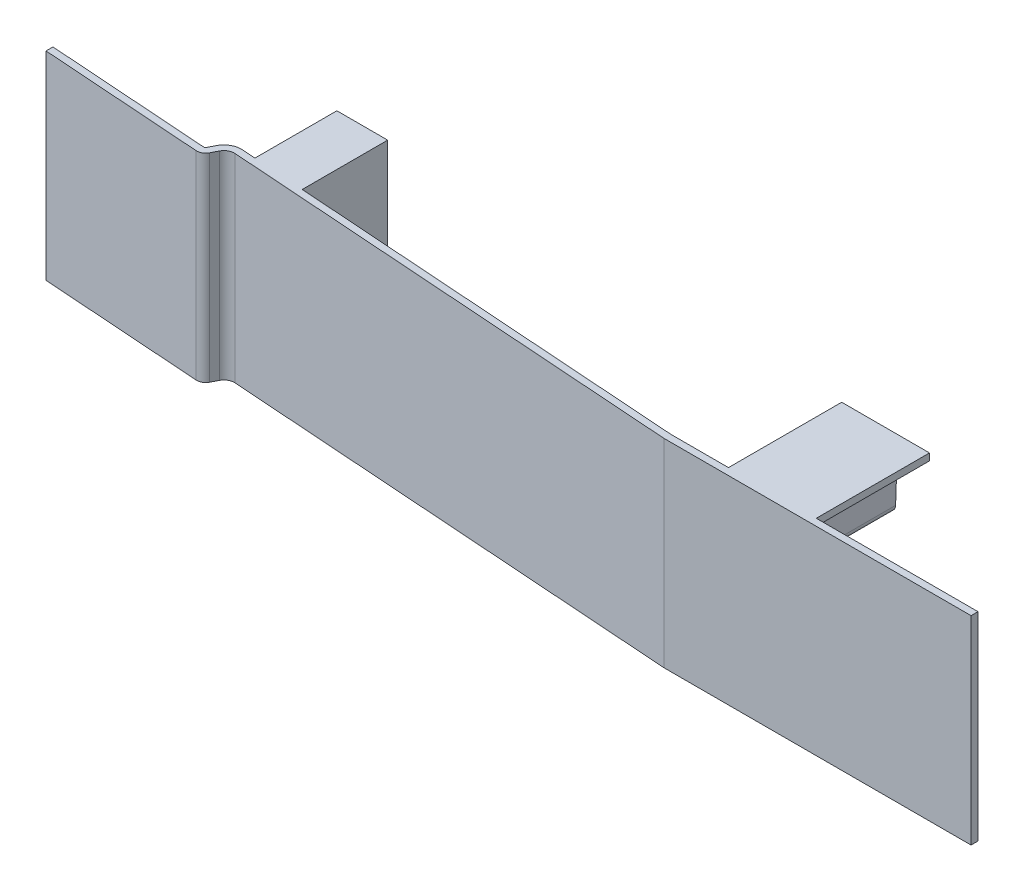
ISO-10303-21;
HEADER;
FILE_DESCRIPTION(('STEP AP214'),'2;1');
FILE_NAME('part.step','',(''),(''),'','','');
FILE_SCHEMA(('AUTOMOTIVE_DESIGN { 1 0 10303 214 1 1 1 1 }'));
ENDSEC;
DATA;
#1=APPLICATION_CONTEXT('core data for automotive mechanical design processes');
#2=APPLICATION_PROTOCOL_DEFINITION('international standard','automotive_design',2000,#1);
#3=PRODUCT_CONTEXT('',#1,'mechanical');
#4=PRODUCT('Part','Part','',(#3));
#5=PRODUCT_RELATED_PRODUCT_CATEGORY('part','',(#4));
#6=PRODUCT_DEFINITION_FORMATION('','',#4);
#7=PRODUCT_DEFINITION_CONTEXT('part definition',#1,'design');
#8=PRODUCT_DEFINITION('design','',#6,#7);
#9=PRODUCT_DEFINITION_SHAPE('','',#8);
#10=(LENGTH_UNIT() NAMED_UNIT(*) SI_UNIT(.MILLI.,.METRE.));
#11=(NAMED_UNIT(*) PLANE_ANGLE_UNIT() SI_UNIT($,.RADIAN.));
#12=(NAMED_UNIT(*) SI_UNIT($,.STERADIAN.) SOLID_ANGLE_UNIT());
#13=UNCERTAINTY_MEASURE_WITH_UNIT(LENGTH_MEASURE(1.E-05),#10,'distance_accuracy_value','');
#14=(GEOMETRIC_REPRESENTATION_CONTEXT(3) GLOBAL_UNCERTAINTY_ASSIGNED_CONTEXT((#13)) GLOBAL_UNIT_ASSIGNED_CONTEXT((#10,
#11,#12)) REPRESENTATION_CONTEXT('',''));
#15=CARTESIAN_POINT('',(0.,0.,0.));
#16=DIRECTION('',(0.,0.,1.));
#17=DIRECTION('',(1.,0.,0.));
#18=AXIS2_PLACEMENT_3D('',#15,#16,#17);
#19=CARTESIAN_POINT('',(43.,43.,-3.));
#20=DIRECTION('',(0.,0.,1.));
#21=DIRECTION('',(1.,0.,0.));
#22=AXIS2_PLACEMENT_3D('',#19,#20,#21);
#23=PLANE('',#22);
#24=DIRECTION('',(0.,1.,0.));
#25=VECTOR('',#24,1.);
#26=CARTESIAN_POINT('',(-65.,39.,-2.99999999999998));
#27=LINE('',#26,#25);
#28=CARTESIAN_POINT('',(-65.,39.,-2.99999999999998));
#29=VERTEX_POINT('',#28);
#30=CARTESIAN_POINT('',(-65.,43.,-2.99999999999999));
#31=VERTEX_POINT('',#30);
#32=EDGE_CURVE('E46',#29,#31,#27,.T.);
#33=ORIENTED_EDGE('',*,*,#32,.F.);
#34=CARTESIAN_POINT('',(-65.,34.,-2.99999999999998));
#35=DIRECTION('',(0.,0.,1.));
#36=DIRECTION('',(1.,0.,0.));
#37=AXIS2_PLACEMENT_3D('',#34,#35,#36);
#38=CIRCLE('',#37,4.99999999999999);
#39=CARTESIAN_POINT('',(-60.0030458649045,34.1744974835125,-2.99999999999999));
#40=VERTEX_POINT('',#39);
#41=EDGE_CURVE('E534',#40,#29,#38,.T.);
#42=ORIENTED_EDGE('',*,*,#41,.F.);
#43=DIRECTION('',(-0.0348994967025047,0.999390827019096,0.));
#44=VECTOR('',#43,1.);
#45=CARTESIAN_POINT('',(-59.3683784276544,16.,-2.99999999999999));
#46=LINE('',#45,#44);
#47=CARTESIAN_POINT('',(-59.3683784276544,16.,-2.99999999999999));
#48=VERTEX_POINT('',#47);
#49=EDGE_CURVE('E531',#48,#40,#46,.T.);
#50=ORIENTED_EDGE('',*,*,#49,.F.);
#51=CARTESIAN_POINT('',(-56.2598253626173,16.108553065037,-2.99999999999999));
#52=DIRECTION('',(0.,0.,-1.));
#53=DIRECTION('',(1.,0.,0.));
#54=AXIS2_PLACEMENT_3D('',#51,#52,#53);
#55=CIRCLE('',#54,3.11044786583541);
#56=CARTESIAN_POINT('',(-56.3683784276544,13.,-2.99999999999999));
#57=VERTEX_POINT('',#56);
#58=EDGE_CURVE('E528',#57,#48,#55,.T.);
#59=ORIENTED_EDGE('',*,*,#58,.F.);
#60=DIRECTION('',(-1.,0.,0.));
#61=VECTOR('',#60,1.);
#62=CARTESIAN_POINT('',(-44.6665423418374,13.,-2.99999999999999));
#63=LINE('',#62,#61);
#64=CARTESIAN_POINT('',(-44.6665423418374,13.,-2.99999999999999));
#65=VERTEX_POINT('',#64);
#66=EDGE_CURVE('E525',#65,#57,#63,.T.);
#67=ORIENTED_EDGE('',*,*,#66,.F.);
#68=CARTESIAN_POINT('',(-44.6665423418374,16.,-2.99999999999999));
#69=DIRECTION('',(0.,0.,-1.));
#70=DIRECTION('',(1.,0.,0.));
#71=AXIS2_PLACEMENT_3D('',#68,#69,#70);
#72=CIRCLE('',#71,3.00000000000001);
#73=CARTESIAN_POINT('',(-41.6665423418374,16.,-2.99999999999999));
#74=VERTEX_POINT('',#73);
#75=EDGE_CURVE('E522',#74,#65,#72,.T.);
#76=ORIENTED_EDGE('',*,*,#75,.F.);
#77=DIRECTION('',(-0.0348994967025042,-0.999390827019096,0.));
#78=VECTOR('',#77,1.);
#79=CARTESIAN_POINT('',(-40.9969541350955,35.1744974835125,-2.99999999999999));
#80=LINE('',#79,#78);
#81=CARTESIAN_POINT('',(-40.9969541350955,35.1744974835125,-2.99999999999999));
#82=VERTEX_POINT('',#81);
#83=EDGE_CURVE('E519',#82,#74,#80,.T.);
#84=ORIENTED_EDGE('',*,*,#83,.F.);
#85=CARTESIAN_POINT('',(-36.,35.,-2.99999999999999));
#86=DIRECTION('',(0.,0.,1.));
#87=DIRECTION('',(1.,0.,0.));
#88=AXIS2_PLACEMENT_3D('',#85,#86,#87);
#89=CIRCLE('',#88,5.);
#90=CARTESIAN_POINT('',(-36.,40.,-2.99999999999999));
#91=VERTEX_POINT('',#90);
#92=EDGE_CURVE('E516',#91,#82,#89,.T.);
#93=ORIENTED_EDGE('',*,*,#92,.F.);
#94=DIRECTION('',(-1.,0.,0.));
#95=VECTOR('',#94,1.);
#96=CARTESIAN_POINT('',(-27.,40.,-2.99999999999999));
#97=LINE('',#96,#95);
#98=CARTESIAN_POINT('',(-27.,40.,-2.99999999999999));
#99=VERTEX_POINT('',#98);
#100=EDGE_CURVE('E240',#99,#91,#97,.T.);
#101=ORIENTED_EDGE('',*,*,#100,.F.);
#102=DIRECTION('',(0.,-1.,0.));
#103=VECTOR('',#102,1.);
#104=CARTESIAN_POINT('',(-27.,43.,-2.99999999999999));
#105=LINE('',#104,#103);
#106=CARTESIAN_POINT('',(-27.,43.,-2.99999999999999));
#107=VERTEX_POINT('',#106);
#108=EDGE_CURVE('E228',#107,#99,#105,.T.);
#109=ORIENTED_EDGE('',*,*,#108,.F.);
#110=DIRECTION('',(-1.,0.,0.));
#111=VECTOR('',#110,1.);
#112=CARTESIAN_POINT('',(43.,43.,-3.));
#113=LINE('',#112,#111);
#114=CARTESIAN_POINT('',(43.,43.,-3.));
#115=VERTEX_POINT('',#114);
#116=EDGE_CURVE('E237',#115,#107,#113,.T.);
#117=ORIENTED_EDGE('',*,*,#116,.F.);
#118=DIRECTION('',(0.,-1.,0.));
#119=VECTOR('',#118,1.);
#120=CARTESIAN_POINT('',(43.,43.,-3.));
#121=LINE('',#120,#119);
#122=CARTESIAN_POINT('',(43.,-43.,-3.));
#123=VERTEX_POINT('',#122);
#124=EDGE_CURVE('E11',#115,#123,#121,.T.);
#125=ORIENTED_EDGE('',*,*,#124,.T.);
#126=DIRECTION('',(-1.,0.,0.));
#127=VECTOR('',#126,1.);
#128=CARTESIAN_POINT('',(43.,-43.,-3.));
#129=LINE('',#128,#127);
#130=CARTESIAN_POINT('',(-89.8952376915247,-43.,-2.99999999999998));
#131=VERTEX_POINT('',#130);
#132=EDGE_CURVE('E328',#123,#131,#129,.T.);
#133=ORIENTED_EDGE('',*,*,#132,.T.);
#134=DIRECTION('',(0.,-1.,0.));
#135=VECTOR('',#134,1.);
#136=CARTESIAN_POINT('',(-89.8952376915247,43.,-2.99999999999998));
#137=LINE('',#136,#135);
#138=CARTESIAN_POINT('',(-89.8952376915247,43.,-2.99999999999998));
#139=VERTEX_POINT('',#138);
#140=EDGE_CURVE('E39',#139,#131,#137,.T.);
#141=ORIENTED_EDGE('',*,*,#140,.F.);
#142=EDGE_CURVE('E247',#31,#139,#113,.T.);
#143=ORIENTED_EDGE('',*,*,#142,.F.);
#144=EDGE_LOOP('',(#33,#42,#50,#59,#67,#76,#84,#93,#101,#109,#117,#125,#133,#141,#143));
#145=FACE_BOUND('',#144,.T.);
#146=ADVANCED_FACE('F31',(#145),#23,.F.);
#147=CARTESIAN_POINT('',(43.,43.,0.));
#148=DIRECTION('',(-1.,0.,0.));
#149=DIRECTION('',(0.,0.,1.));
#150=AXIS2_PLACEMENT_3D('',#147,#148,#149);
#151=PLANE('',#150);
#152=DIRECTION('',(0.,-1.,0.));
#153=VECTOR('',#152,1.);
#154=CARTESIAN_POINT('',(43.,43.,0.));
#155=LINE('',#154,#153);
#156=CARTESIAN_POINT('',(43.,43.,0.));
#157=VERTEX_POINT('',#156);
#158=CARTESIAN_POINT('',(43.,-43.,0.));
#159=VERTEX_POINT('',#158);
#160=EDGE_CURVE('E282',#157,#159,#155,.T.);
#161=ORIENTED_EDGE('',*,*,#160,.T.);
#162=DIRECTION('',(0.,0.,-1.));
#163=VECTOR('',#162,1.);
#164=CARTESIAN_POINT('',(43.,-43.,0.));
#165=LINE('',#164,#163);
#166=EDGE_CURVE('E334',#159,#123,#165,.T.);
#167=ORIENTED_EDGE('',*,*,#166,.T.);
#168=ORIENTED_EDGE('',*,*,#124,.F.);
#169=DIRECTION('',(0.,0.,-1.));
#170=VECTOR('',#169,1.);
#171=CARTESIAN_POINT('',(43.,43.,0.));
#172=LINE('',#171,#170);
#173=EDGE_CURVE('E244',#157,#115,#172,.T.);
#174=ORIENTED_EDGE('',*,*,#173,.F.);
#175=EDGE_LOOP('',(#161,#167,#168,#174));
#176=FACE_BOUND('',#175,.T.);
#177=ADVANCED_FACE('F33',(#176),#151,.F.);
#178=CARTESIAN_POINT('',(-89.8952376915247,43.,-2.99999999999998));
#179=DIRECTION('',(-0.0697564737441253,0.,0.997564050259824));
#180=DIRECTION('',(0.997564050259824,0.,0.0697564737441253));
#181=AXIS2_PLACEMENT_3D('',#178,#179,#180);
#182=PLANE('',#181);
#183=ORIENTED_EDGE('',*,*,#140,.T.);
#184=DIRECTION('',(-0.997564050259824,0.,-0.0697564737441253));
#185=VECTOR('',#184,1.);
#186=CARTESIAN_POINT('',(-89.8952376915247,-43.,-2.99999999999998));
#187=LINE('',#186,#185);
#188=CARTESIAN_POINT('',(-261.5,-43.,-14.9997739425555));
#189=VERTEX_POINT('',#188);
#190=EDGE_CURVE('E320',#131,#189,#187,.T.);
#191=ORIENTED_EDGE('',*,*,#190,.T.);
#192=DIRECTION('',(0.,-1.,0.));
#193=VECTOR('',#192,1.);
#194=CARTESIAN_POINT('',(-261.5,43.,-14.9997739425555));
#195=LINE('',#194,#193);
#196=CARTESIAN_POINT('',(-261.5,43.,-14.9997739425555));
#197=VERTEX_POINT('',#196);
#198=EDGE_CURVE('E312',#197,#189,#195,.T.);
#199=ORIENTED_EDGE('',*,*,#198,.F.);
#200=DIRECTION('',(-0.997564050259824,0.,-0.0697564737441253));
#201=VECTOR('',#200,1.);
#202=CARTESIAN_POINT('',(-89.8952376915247,43.,-2.99999999999998));
#203=LINE('',#202,#201);
#204=EDGE_CURVE('E246',#139,#197,#203,.T.);
#205=ORIENTED_EDGE('',*,*,#204,.F.);
#206=EDGE_LOOP('',(#183,#191,#199,#205));
#207=FACE_BOUND('',#206,.T.);
#208=ADVANCED_FACE('F318',(#207),#182,.F.);
#209=CARTESIAN_POINT('',(-261.5,43.,-52.));
#210=DIRECTION('',(-1.,0.,0.));
#211=DIRECTION('',(0.,0.,1.));
#212=AXIS2_PLACEMENT_3D('',#209,#210,#211);
#213=PLANE('',#212);
#214=ORIENTED_EDGE('',*,*,#198,.T.);
#215=DIRECTION('',(0.,0.,-1.));
#216=VECTOR('',#215,1.);
#217=CARTESIAN_POINT('',(-261.5,-43.,-52.));
#218=LINE('',#217,#216);
#219=CARTESIAN_POINT('',(-261.5,-43.,-52.));
#220=VERTEX_POINT('',#219);
#221=EDGE_CURVE('E332',#189,#220,#218,.T.);
#222=ORIENTED_EDGE('',*,*,#221,.T.);
#223=DIRECTION('',(0.,-1.,0.));
#224=VECTOR('',#223,1.);
#225=CARTESIAN_POINT('',(-261.5,43.,-52.));
#226=LINE('',#225,#224);
#227=CARTESIAN_POINT('',(-261.5,43.,-52.));
#228=VERTEX_POINT('',#227);
#229=EDGE_CURVE('E310',#228,#220,#226,.T.);
#230=ORIENTED_EDGE('',*,*,#229,.F.);
#231=DIRECTION('',(0.,0.,-1.));
#232=VECTOR('',#231,1.);
#233=CARTESIAN_POINT('',(-261.5,43.,-52.));
#234=LINE('',#233,#232);
#235=EDGE_CURVE('E249',#197,#228,#234,.T.);
#236=ORIENTED_EDGE('',*,*,#235,.F.);
#237=EDGE_LOOP('',(#214,#222,#230,#236));
#238=FACE_BOUND('',#237,.T.);
#239=ADVANCED_FACE('F393',(#238),#213,.F.);
#240=CARTESIAN_POINT('',(-283.5,43.,-52.));
#241=DIRECTION('',(0.,0.,1.));
#242=DIRECTION('',(1.,0.,0.));
#243=AXIS2_PLACEMENT_3D('',#240,#241,#242);
#244=PLANE('',#243);
#245=ORIENTED_EDGE('',*,*,#229,.T.);
#246=DIRECTION('',(-1.,0.,0.));
#247=VECTOR('',#246,1.);
#248=CARTESIAN_POINT('',(-283.5,-43.,-52.));
#249=LINE('',#248,#247);
#250=CARTESIAN_POINT('',(-283.5,-43.,-52.));
#251=VERTEX_POINT('',#250);
#252=EDGE_CURVE('E341',#220,#251,#249,.T.);
#253=ORIENTED_EDGE('',*,*,#252,.T.);
#254=DIRECTION('',(0.,-1.,0.));
#255=VECTOR('',#254,1.);
#256=CARTESIAN_POINT('',(-283.5,43.,-52.));
#257=LINE('',#256,#255);
#258=CARTESIAN_POINT('',(-283.5,43.,-52.));
#259=VERTEX_POINT('',#258);
#260=EDGE_CURVE('E308',#259,#251,#257,.T.);
#261=ORIENTED_EDGE('',*,*,#260,.F.);
#262=DIRECTION('',(-1.,0.,0.));
#263=VECTOR('',#262,1.);
#264=CARTESIAN_POINT('',(-283.5,43.,-52.));
#265=LINE('',#264,#263);
#266=EDGE_CURVE('E255',#228,#259,#265,.T.);
#267=ORIENTED_EDGE('',*,*,#266,.F.);
#268=EDGE_LOOP('',(#245,#253,#261,#267));
#269=FACE_BOUND('',#268,.T.);
#270=ADVANCED_FACE('F400',(#269),#244,.F.);
#271=CARTESIAN_POINT('',(-283.5,43.,-16.5381638053128));
#272=DIRECTION('',(1.,0.,0.));
#273=DIRECTION('',(0.,0.,-1.));
#274=AXIS2_PLACEMENT_3D('',#271,#272,#273);
#275=PLANE('',#274);
#276=ORIENTED_EDGE('',*,*,#260,.T.);
#277=DIRECTION('',(0.,0.,1.));
#278=VECTOR('',#277,1.);
#279=CARTESIAN_POINT('',(-283.5,-43.,-16.5381638053128));
#280=LINE('',#279,#278);
#281=CARTESIAN_POINT('',(-283.5,-43.,-16.5381638053128));
#282=VERTEX_POINT('',#281);
#283=EDGE_CURVE('E344',#251,#282,#280,.T.);
#284=ORIENTED_EDGE('',*,*,#283,.T.);
#285=DIRECTION('',(0.,-1.,0.));
#286=VECTOR('',#285,1.);
#287=CARTESIAN_POINT('',(-283.5,43.,-16.5381638053128));
#288=LINE('',#287,#286);
#289=CARTESIAN_POINT('',(-283.5,43.,-16.5381638053128));
#290=VERTEX_POINT('',#289);
#291=EDGE_CURVE('E306',#290,#282,#288,.T.);
#292=ORIENTED_EDGE('',*,*,#291,.F.);
#293=DIRECTION('',(0.,0.,1.));
#294=VECTOR('',#293,1.);
#295=CARTESIAN_POINT('',(-283.5,43.,-16.5381638053128));
#296=LINE('',#295,#294);
#297=EDGE_CURVE('E257',#259,#290,#296,.T.);
#298=ORIENTED_EDGE('',*,*,#297,.F.);
#299=EDGE_LOOP('',(#276,#284,#292,#298));
#300=FACE_BOUND('',#299,.T.);
#301=ADVANCED_FACE('F404',(#300),#275,.F.);
#302=CARTESIAN_POINT('',(-283.5,43.,-16.5381638053128));
#303=DIRECTION('',(-0.069756473744126,0.,0.997564050259824));
#304=DIRECTION('',(0.997564050259824,0.,0.069756473744126));
#305=AXIS2_PLACEMENT_3D('',#302,#303,#304);
#306=PLANE('',#305);
#307=ORIENTED_EDGE('',*,*,#291,.T.);
#308=DIRECTION('',(-0.997564050259824,0.,-0.069756473744126));
#309=VECTOR('',#308,1.);
#310=CARTESIAN_POINT('',(-283.5,-43.,-16.5381638053128));
#311=LINE('',#310,#309);
#312=CARTESIAN_POINT('',(-289.303540630732,-43.,-16.9439868996045));
#313=VERTEX_POINT('',#312);
#314=EDGE_CURVE('E347',#282,#313,#311,.T.);
#315=ORIENTED_EDGE('',*,*,#314,.T.);
#316=DIRECTION('',(0.,-1.,0.));
#317=VECTOR('',#316,1.);
#318=CARTESIAN_POINT('',(-289.303540630732,43.,-16.9439868996045));
#319=LINE('',#318,#317);
#320=CARTESIAN_POINT('',(-289.303540630732,43.,-16.9439868996045));
#321=VERTEX_POINT('',#320);
#322=EDGE_CURVE('E304',#321,#313,#319,.T.);
#323=ORIENTED_EDGE('',*,*,#322,.F.);
#324=DIRECTION('',(-0.997564050259824,0.,-0.069756473744126));
#325=VECTOR('',#324,1.);
#326=CARTESIAN_POINT('',(-283.5,43.,-16.5381638053128));
#327=LINE('',#326,#325);
#328=EDGE_CURVE('E259',#290,#321,#327,.T.);
#329=ORIENTED_EDGE('',*,*,#328,.F.);
#330=EDGE_LOOP('',(#307,#315,#323,#329));
#331=FACE_BOUND('',#330,.T.);
#332=ADVANCED_FACE('F408',(#331),#306,.F.);
#333=CARTESIAN_POINT('',(-289.82898165851,43.,-9.42983012377236));
#334=DIRECTION('',(0.,-1.,0.));
#335=DIRECTION('',(0.,0.,-1.));
#336=AXIS2_PLACEMENT_3D('',#333,#334,#335);
#337=CYLINDRICAL_SURFACE('',#336,7.5325055808447);
#338=ORIENTED_EDGE('',*,*,#322,.T.);
#339=CARTESIAN_POINT('',(-289.82898165851,-43.,-9.42983012377236));
#340=DIRECTION('',(0.,1.,0.));
#341=DIRECTION('',(0.,0.,1.));
#342=AXIS2_PLACEMENT_3D('',#339,#340,#341);
#343=CIRCLE('',#342,7.5325055808447);
#344=CARTESIAN_POINT('',(-296.540493274528,-43.,-12.849516096711));
#345=VERTEX_POINT('',#344);
#346=EDGE_CURVE('E350',#313,#345,#343,.T.);
#347=ORIENTED_EDGE('',*,*,#346,.T.);
#348=DIRECTION('',(0.,-1.,0.));
#349=VECTOR('',#348,1.);
#350=CARTESIAN_POINT('',(-296.540493274528,43.,-12.849516096711));
#351=LINE('',#350,#349);
#352=CARTESIAN_POINT('',(-296.540493274528,43.,-12.849516096711));
#353=VERTEX_POINT('',#352);
#354=EDGE_CURVE('E302',#353,#345,#351,.T.);
#355=ORIENTED_EDGE('',*,*,#354,.F.);
#356=CARTESIAN_POINT('',(-289.82898165851,43.,-9.42983012377236));
#357=DIRECTION('',(0.,1.,0.));
#358=DIRECTION('',(0.,0.,1.));
#359=AXIS2_PLACEMENT_3D('',#356,#357,#358);
#360=CIRCLE('',#359,7.5325055808447);
#361=EDGE_CURVE('E261',#321,#353,#360,.T.);
#362=ORIENTED_EDGE('',*,*,#361,.F.);
#363=EDGE_LOOP('',(#338,#347,#355,#362));
#364=FACE_BOUND('',#363,.T.);
#365=ADVANCED_FACE('F412',(#364),#337,.T.);
#366=CARTESIAN_POINT('',(-296.540493274528,43.,-12.849516096711));
#367=DIRECTION('',(0.891006524188368,0.,0.453990499739547));
#368=DIRECTION('',(0.453990499739547,0.,-0.891006524188368));
#369=AXIS2_PLACEMENT_3D('',#366,#367,#368);
#370=PLANE('',#369);
#371=ORIENTED_EDGE('',*,*,#354,.T.);
#372=DIRECTION('',(-0.453990499739547,0.,0.891006524188368));
#373=VECTOR('',#372,1.);
#374=CARTESIAN_POINT('',(-296.540493274528,-43.,-12.849516096711));
#375=LINE('',#374,#373);
#376=CARTESIAN_POINT('',(-297.941817373459,-43.,-10.0992626985321));
#377=VERTEX_POINT('',#376);
#378=EDGE_CURVE('E353',#345,#377,#375,.T.);
#379=ORIENTED_EDGE('',*,*,#378,.T.);
#380=DIRECTION('',(0.,-1.,0.));
#381=VECTOR('',#380,1.);
#382=CARTESIAN_POINT('',(-297.941817373459,43.,-10.0992626985321));
#383=LINE('',#382,#381);
#384=CARTESIAN_POINT('',(-297.941817373459,43.,-10.0992626985321));
#385=VERTEX_POINT('',#384);
#386=EDGE_CURVE('E300',#385,#377,#383,.T.);
#387=ORIENTED_EDGE('',*,*,#386,.F.);
#388=DIRECTION('',(-0.453990499739547,0.,0.891006524188368));
#389=VECTOR('',#388,1.);
#390=CARTESIAN_POINT('',(-296.540493274528,43.,-12.849516096711));
#391=LINE('',#390,#389);
#392=EDGE_CURVE('E263',#353,#385,#391,.T.);
#393=ORIENTED_EDGE('',*,*,#392,.F.);
#394=EDGE_LOOP('',(#371,#379,#387,#393));
#395=FACE_BOUND('',#394,.T.);
#396=ADVANCED_FACE('F416',(#395),#370,.F.);
#397=CARTESIAN_POINT('',(-298.77448010671,43.,-10.523525551969));
#398=DIRECTION('',(0.,-1.,0.));
#399=DIRECTION('',(0.,0.,-1.));
#400=AXIS2_PLACEMENT_3D('',#397,#398,#399);
#401=CYLINDRICAL_SURFACE('',#400,0.934519232627875);
#402=ORIENTED_EDGE('',*,*,#386,.T.);
#403=CARTESIAN_POINT('',(-298.77448010671,-43.,-10.523525551969));
#404=DIRECTION('',(0.,-1.,0.));
#405=DIRECTION('',(0.,0.,-1.));
#406=AXIS2_PLACEMENT_3D('',#403,#404,#405);
#407=CIRCLE('',#406,0.934519232627875);
#408=CARTESIAN_POINT('',(-298.839668873024,-43.,-9.59128276122307));
#409=VERTEX_POINT('',#408);
#410=EDGE_CURVE('E356',#377,#409,#407,.T.);
#411=ORIENTED_EDGE('',*,*,#410,.T.);
#412=DIRECTION('',(0.,-1.,0.));
#413=VECTOR('',#412,1.);
#414=CARTESIAN_POINT('',(-298.839668873024,43.,-9.59128276122307));
#415=LINE('',#414,#413);
#416=CARTESIAN_POINT('',(-298.839668873024,43.,-9.59128276122307));
#417=VERTEX_POINT('',#416);
#418=EDGE_CURVE('E298',#417,#409,#415,.T.);
#419=ORIENTED_EDGE('',*,*,#418,.F.);
#420=CARTESIAN_POINT('',(-298.77448010671,43.,-10.523525551969));
#421=DIRECTION('',(0.,-1.,0.));
#422=DIRECTION('',(0.,0.,-1.));
#423=AXIS2_PLACEMENT_3D('',#420,#421,#422);
#424=CIRCLE('',#423,0.934519232627875);
#425=EDGE_CURVE('E265',#385,#417,#424,.T.);
#426=ORIENTED_EDGE('',*,*,#425,.F.);
#427=EDGE_LOOP('',(#402,#411,#419,#426));
#428=FACE_BOUND('',#427,.T.);
#429=ADVANCED_FACE('F420',(#428),#401,.F.);
#430=CARTESIAN_POINT('',(-298.839668873024,43.,-9.59128276122307));
#431=DIRECTION('',(-0.0697564737441245,0.,0.997564050259824));
#432=DIRECTION('',(0.997564050259824,0.,0.0697564737441245));
#433=AXIS2_PLACEMENT_3D('',#430,#431,#432);
#434=PLANE('',#433);
#435=ORIENTED_EDGE('',*,*,#418,.T.);
#436=DIRECTION('',(-0.997564050259824,0.,-0.0697564737441245));
#437=VECTOR('',#436,1.);
#438=CARTESIAN_POINT('',(-298.839668873024,-43.,-9.59128276122307));
#439=LINE('',#438,#437);
#440=CARTESIAN_POINT('',(-368.878421812444,-43.,-14.4888694667758));
#441=VERTEX_POINT('',#440);
#442=EDGE_CURVE('E359',#409,#441,#439,.T.);
#443=ORIENTED_EDGE('',*,*,#442,.T.);
#444=DIRECTION('',(0.,-1.,0.));
#445=VECTOR('',#444,1.);
#446=CARTESIAN_POINT('',(-368.878421812444,43.,-14.4888694667758));
#447=LINE('',#446,#445);
#448=CARTESIAN_POINT('',(-368.878421812444,43.,-14.4888694667758));
#449=VERTEX_POINT('',#448);
#450=EDGE_CURVE('E296',#449,#441,#447,.T.);
#451=ORIENTED_EDGE('',*,*,#450,.F.);
#452=DIRECTION('',(-0.997564050259824,0.,-0.0697564737441245));
#453=VECTOR('',#452,1.);
#454=CARTESIAN_POINT('',(-298.839668873024,43.,-9.59128276122307));
#455=LINE('',#454,#453);
#456=EDGE_CURVE('E267',#417,#449,#455,.T.);
#457=ORIENTED_EDGE('',*,*,#456,.F.);
#458=EDGE_LOOP('',(#435,#443,#451,#457));
#459=FACE_BOUND('',#458,.T.);
#460=ADVANCED_FACE('F424',(#459),#434,.F.);
#461=CARTESIAN_POINT('',(-368.878421812444,43.,-11.4815437725323));
#462=DIRECTION('',(1.,0.,0.));
#463=DIRECTION('',(0.,0.,-1.));
#464=AXIS2_PLACEMENT_3D('',#461,#462,#463);
#465=PLANE('',#464);
#466=ORIENTED_EDGE('',*,*,#450,.T.);
#467=DIRECTION('',(0.,0.,1.));
#468=VECTOR('',#467,1.);
#469=CARTESIAN_POINT('',(-368.878421812444,-43.,-11.4815437725323));
#470=LINE('',#469,#468);
#471=CARTESIAN_POINT('',(-368.878421812444,-43.,-11.4815437725323));
#472=VERTEX_POINT('',#471);
#473=EDGE_CURVE('E362',#441,#472,#470,.T.);
#474=ORIENTED_EDGE('',*,*,#473,.T.);
#475=DIRECTION('',(0.,-1.,0.));
#476=VECTOR('',#475,1.);
#477=CARTESIAN_POINT('',(-368.878421812444,43.,-11.4815437725323));
#478=LINE('',#477,#476);
#479=CARTESIAN_POINT('',(-368.878421812444,43.,-11.4815437725323));
#480=VERTEX_POINT('',#479);
#481=EDGE_CURVE('E294',#480,#472,#478,.T.);
#482=ORIENTED_EDGE('',*,*,#481,.F.);
#483=DIRECTION('',(0.,0.,1.));
#484=VECTOR('',#483,1.);
#485=CARTESIAN_POINT('',(-368.878421812444,43.,-11.4815437725323));
#486=LINE('',#485,#484);
#487=EDGE_CURVE('E269',#449,#480,#486,.T.);
#488=ORIENTED_EDGE('',*,*,#487,.F.);
#489=EDGE_LOOP('',(#466,#474,#482,#488));
#490=FACE_BOUND('',#489,.T.);
#491=ADVANCED_FACE('F428',(#490),#465,.F.);
#492=CARTESIAN_POINT('',(-368.878421812444,43.,-11.4815437725323));
#493=DIRECTION('',(0.0697564737441244,0.,-0.997564050259824));
#494=DIRECTION('',(-0.997564050259824,0.,-0.0697564737441244));
#495=AXIS2_PLACEMENT_3D('',#492,#493,#494);
#496=PLANE('',#495);
#497=ORIENTED_EDGE('',*,*,#481,.T.);
#498=DIRECTION('',(0.997564050259824,0.,0.0697564737441244));
#499=VECTOR('',#498,1.);
#500=CARTESIAN_POINT('',(-368.878421812444,-43.,-11.4815437725323));
#501=LINE('',#500,#499);
#502=CARTESIAN_POINT('',(-299.048938294256,-43.,-6.5985906104436));
#503=VERTEX_POINT('',#502);
#504=EDGE_CURVE('E365',#472,#503,#501,.T.);
#505=ORIENTED_EDGE('',*,*,#504,.T.);
#506=DIRECTION('',(0.,-1.,0.));
#507=VECTOR('',#506,1.);
#508=CARTESIAN_POINT('',(-299.048938294256,43.,-6.5985906104436));
#509=LINE('',#508,#507);
#510=CARTESIAN_POINT('',(-299.048938294256,43.,-6.5985906104436));
#511=VERTEX_POINT('',#510);
#512=EDGE_CURVE('E292',#511,#503,#509,.T.);
#513=ORIENTED_EDGE('',*,*,#512,.F.);
#514=DIRECTION('',(0.997564050259824,0.,0.0697564737441244));
#515=VECTOR('',#514,1.);
#516=CARTESIAN_POINT('',(-368.878421812444,43.,-11.4815437725323));
#517=LINE('',#516,#515);
#518=EDGE_CURVE('E271',#480,#511,#517,.T.);
#519=ORIENTED_EDGE('',*,*,#518,.F.);
#520=EDGE_LOOP('',(#497,#505,#513,#519));
#521=FACE_BOUND('',#520,.T.);
#522=ADVANCED_FACE('F432',(#521),#496,.F.);
#523=CARTESIAN_POINT('',(-298.77448010671,43.,-10.523525551969));
#524=DIRECTION('',(0.,-1.,0.));
#525=DIRECTION('',(0.,0.,-1.));
#526=AXIS2_PLACEMENT_3D('',#523,#524,#525);
#527=CYLINDRICAL_SURFACE('',#526,3.93451923262788);
#528=ORIENTED_EDGE('',*,*,#512,.T.);
#529=CARTESIAN_POINT('',(-298.77448010671,-43.,-10.523525551969));
#530=DIRECTION('',(0.,1.,0.));
#531=DIRECTION('',(0.,0.,1.));
#532=AXIS2_PLACEMENT_3D('',#529,#530,#531);
#533=CIRCLE('',#532,3.93451923262788);
#534=CARTESIAN_POINT('',(-295.268797800894,-43.,-8.73729119931345));
#535=VERTEX_POINT('',#534);
#536=EDGE_CURVE('E368',#503,#535,#533,.T.);
#537=ORIENTED_EDGE('',*,*,#536,.T.);
#538=DIRECTION('',(0.,-1.,0.));
#539=VECTOR('',#538,1.);
#540=CARTESIAN_POINT('',(-295.268797800894,43.,-8.73729119931345));
#541=LINE('',#540,#539);
#542=CARTESIAN_POINT('',(-295.268797800894,43.,-8.73729119931345));
#543=VERTEX_POINT('',#542);
#544=EDGE_CURVE('E290',#543,#535,#541,.T.);
#545=ORIENTED_EDGE('',*,*,#544,.F.);
#546=CARTESIAN_POINT('',(-298.77448010671,43.,-10.523525551969));
#547=DIRECTION('',(0.,1.,0.));
#548=DIRECTION('',(0.,0.,1.));
#549=AXIS2_PLACEMENT_3D('',#546,#547,#548);
#550=CIRCLE('',#549,3.93451923262788);
#551=EDGE_CURVE('E273',#511,#543,#550,.T.);
#552=ORIENTED_EDGE('',*,*,#551,.F.);
#553=EDGE_LOOP('',(#528,#537,#545,#552));
#554=FACE_BOUND('',#553,.T.);
#555=ADVANCED_FACE('F436',(#554),#527,.T.);
#556=CARTESIAN_POINT('',(-293.867473701963,43.,-11.4875445974923));
#557=DIRECTION('',(-0.891006524188368,0.,-0.453990499739547));
#558=DIRECTION('',(-0.453990499739547,0.,0.891006524188368));
#559=AXIS2_PLACEMENT_3D('',#556,#557,#558);
#560=PLANE('',#559);
#561=ORIENTED_EDGE('',*,*,#544,.T.);
#562=DIRECTION('',(0.453990499739547,0.,-0.891006524188368));
#563=VECTOR('',#562,1.);
#564=CARTESIAN_POINT('',(-293.867473701963,-43.,-11.4875445974923));
#565=LINE('',#564,#563);
#566=CARTESIAN_POINT('',(-293.867473701963,-43.,-11.4875445974923));
#567=VERTEX_POINT('',#566);
#568=EDGE_CURVE('E371',#535,#567,#565,.T.);
#569=ORIENTED_EDGE('',*,*,#568,.T.);
#570=DIRECTION('',(0.,-1.,0.));
#571=VECTOR('',#570,1.);
#572=CARTESIAN_POINT('',(-293.867473701963,43.,-11.4875445974923));
#573=LINE('',#572,#571);
#574=CARTESIAN_POINT('',(-293.867473701963,43.,-11.4875445974923));
#575=VERTEX_POINT('',#574);
#576=EDGE_CURVE('E288',#575,#567,#573,.T.);
#577=ORIENTED_EDGE('',*,*,#576,.F.);
#578=DIRECTION('',(0.453990499739547,0.,-0.891006524188368));
#579=VECTOR('',#578,1.);
#580=CARTESIAN_POINT('',(-293.867473701963,43.,-11.4875445974923));
#581=LINE('',#580,#579);
#582=EDGE_CURVE('E275',#543,#575,#581,.T.);
#583=ORIENTED_EDGE('',*,*,#582,.F.);
#584=EDGE_LOOP('',(#561,#569,#577,#583));
#585=FACE_BOUND('',#584,.T.);
#586=ADVANCED_FACE('F440',(#585),#560,.F.);
#587=CARTESIAN_POINT('',(-289.82898165851,43.,-9.42983012377236));
#588=DIRECTION('',(0.,-1.,0.));
#589=DIRECTION('',(0.,0.,-1.));
#590=AXIS2_PLACEMENT_3D('',#587,#588,#589);
#591=CYLINDRICAL_SURFACE('',#590,4.5325055808447);
#592=ORIENTED_EDGE('',*,*,#576,.T.);
#593=CARTESIAN_POINT('',(-289.82898165851,-43.,-9.42983012377236));
#594=DIRECTION('',(0.,-1.,0.));
#595=DIRECTION('',(0.,0.,1.));
#596=AXIS2_PLACEMENT_3D('',#593,#594,#595);
#597=CIRCLE('',#596,4.5325055808447);
#598=CARTESIAN_POINT('',(-289.512810051965,-43.,-13.9512947488251));
#599=VERTEX_POINT('',#598);
#600=EDGE_CURVE('E374',#567,#599,#597,.T.);
#601=ORIENTED_EDGE('',*,*,#600,.T.);
#602=DIRECTION('',(0.,-1.,0.));
#603=VECTOR('',#602,1.);
#604=CARTESIAN_POINT('',(-289.512810051965,43.,-13.9512947488251));
#605=LINE('',#604,#603);
#606=CARTESIAN_POINT('',(-289.512810051965,43.,-13.9512947488251));
#607=VERTEX_POINT('',#606);
#608=EDGE_CURVE('E286',#607,#599,#605,.T.);
#609=ORIENTED_EDGE('',*,*,#608,.F.);
#610=CARTESIAN_POINT('',(-289.82898165851,43.,-9.42983012377236));
#611=DIRECTION('',(0.,-1.,0.));
#612=DIRECTION('',(0.,0.,1.));
#613=AXIS2_PLACEMENT_3D('',#610,#611,#612);
#614=CIRCLE('',#613,4.5325055808447);
#615=EDGE_CURVE('E277',#575,#607,#614,.T.);
#616=ORIENTED_EDGE('',*,*,#615,.F.);
#617=EDGE_LOOP('',(#592,#601,#609,#616));
#618=FACE_BOUND('',#617,.T.);
#619=ADVANCED_FACE('F444',(#618),#591,.F.);
#620=CARTESIAN_POINT('',(-90.,43.,0.));
#621=DIRECTION('',(0.0697564737441254,0.,-0.997564050259824));
#622=DIRECTION('',(-0.997564050259824,0.,-0.0697564737441254));
#623=AXIS2_PLACEMENT_3D('',#620,#621,#622);
#624=PLANE('',#623);
#625=ORIENTED_EDGE('',*,*,#608,.T.);
#626=DIRECTION('',(0.997564050259824,0.,0.0697564737441254));
#627=VECTOR('',#626,1.);
#628=CARTESIAN_POINT('',(-90.,-43.,0.));
#629=LINE('',#628,#627);
#630=CARTESIAN_POINT('',(-90.,-43.,0.));
#631=VERTEX_POINT('',#630);
#632=EDGE_CURVE('E377',#599,#631,#629,.T.);
#633=ORIENTED_EDGE('',*,*,#632,.T.);
#634=DIRECTION('',(0.,-1.,0.));
#635=VECTOR('',#634,1.);
#636=CARTESIAN_POINT('',(-90.,43.,0.));
#637=LINE('',#636,#635);
#638=CARTESIAN_POINT('',(-90.,43.,0.));
#639=VERTEX_POINT('',#638);
#640=EDGE_CURVE('E284',#639,#631,#637,.T.);
#641=ORIENTED_EDGE('',*,*,#640,.F.);
#642=DIRECTION('',(0.997564050259824,0.,0.0697564737441254));
#643=VECTOR('',#642,1.);
#644=CARTESIAN_POINT('',(-90.,43.,0.));
#645=LINE('',#644,#643);
#646=EDGE_CURVE('E279',#607,#639,#645,.T.);
#647=ORIENTED_EDGE('',*,*,#646,.F.);
#648=EDGE_LOOP('',(#625,#633,#641,#647));
#649=FACE_BOUND('',#648,.T.);
#650=ADVANCED_FACE('F448',(#649),#624,.F.);
#651=CARTESIAN_POINT('',(43.,43.,0.));
#652=DIRECTION('',(0.,0.,-1.));
#653=DIRECTION('',(-1.,0.,0.));
#654=AXIS2_PLACEMENT_3D('',#651,#652,#653);
#655=PLANE('',#654);
#656=ORIENTED_EDGE('',*,*,#640,.T.);
#657=DIRECTION('',(1.,0.,0.));
#658=VECTOR('',#657,1.);
#659=CARTESIAN_POINT('',(43.,-43.,0.));
#660=LINE('',#659,#658);
#661=EDGE_CURVE('E379',#631,#159,#660,.T.);
#662=ORIENTED_EDGE('',*,*,#661,.T.);
#663=ORIENTED_EDGE('',*,*,#160,.F.);
#664=DIRECTION('',(1.,0.,0.));
#665=VECTOR('',#664,1.);
#666=CARTESIAN_POINT('',(43.,43.,0.));
#667=LINE('',#666,#665);
#668=EDGE_CURVE('E54',#639,#157,#667,.T.);
#669=ORIENTED_EDGE('',*,*,#668,.F.);
#670=EDGE_LOOP('',(#656,#662,#663,#669));
#671=FACE_BOUND('',#670,.T.);
#672=ADVANCED_FACE('F383',(#671),#655,.F.);
#673=CARTESIAN_POINT('',(-289.82898165851,43.,-9.42983012377236));
#674=DIRECTION('',(0.,1.,0.));
#675=DIRECTION('',(0.,0.,1.));
#676=AXIS2_PLACEMENT_3D('',#673,#674,#675);
#677=PLANE('',#676);
#678=ORIENTED_EDGE('',*,*,#173,.T.);
#679=ORIENTED_EDGE('',*,*,#116,.T.);
#680=DIRECTION('',(0.,0.,1.));
#681=VECTOR('',#680,1.);
#682=CARTESIAN_POINT('',(-27.,43.,-100.414873747641));
#683=LINE('',#682,#681);
#684=CARTESIAN_POINT('',(-27.,43.,-52.));
#685=VERTEX_POINT('',#684);
#686=EDGE_CURVE('E224',#685,#107,#683,.T.);
#687=ORIENTED_EDGE('',*,*,#686,.F.);
#688=DIRECTION('',(-1.,0.,0.));
#689=VECTOR('',#688,1.);
#690=CARTESIAN_POINT('',(-65.,43.,-52.));
#691=LINE('',#690,#689);
#692=CARTESIAN_POINT('',(-65.,43.,-52.));
#693=VERTEX_POINT('',#692);
#694=EDGE_CURVE('E336',#685,#693,#691,.T.);
#695=ORIENTED_EDGE('',*,*,#694,.T.);
#696=DIRECTION('',(0.,0.,1.));
#697=VECTOR('',#696,1.);
#698=CARTESIAN_POINT('',(-65.,43.,-100.414873747641));
#699=LINE('',#698,#697);
#700=EDGE_CURVE('E538',#693,#31,#699,.T.);
#701=ORIENTED_EDGE('',*,*,#700,.T.);
#702=ORIENTED_EDGE('',*,*,#142,.T.);
#703=ORIENTED_EDGE('',*,*,#204,.T.);
#704=ORIENTED_EDGE('',*,*,#235,.T.);
#705=ORIENTED_EDGE('',*,*,#266,.T.);
#706=ORIENTED_EDGE('',*,*,#297,.T.);
#707=ORIENTED_EDGE('',*,*,#328,.T.);
#708=ORIENTED_EDGE('',*,*,#361,.T.);
#709=ORIENTED_EDGE('',*,*,#392,.T.);
#710=ORIENTED_EDGE('',*,*,#425,.T.);
#711=ORIENTED_EDGE('',*,*,#456,.T.);
#712=ORIENTED_EDGE('',*,*,#487,.T.);
#713=ORIENTED_EDGE('',*,*,#518,.T.);
#714=ORIENTED_EDGE('',*,*,#551,.T.);
#715=ORIENTED_EDGE('',*,*,#582,.T.);
#716=ORIENTED_EDGE('',*,*,#615,.T.);
#717=ORIENTED_EDGE('',*,*,#646,.T.);
#718=ORIENTED_EDGE('',*,*,#668,.T.);
#719=EDGE_LOOP('',(#678,#679,#687,#695,#701,#702,#703,#704,#705,#706,#707,#708,#709,#710,#711,
#712,#713,#714,#715,#716,#717,#718));
#720=FACE_BOUND('',#719,.T.);
#721=ADVANCED_FACE('F242',(#720),#677,.T.);
#722=CARTESIAN_POINT('',(-289.82898165851,-43.,-9.42983012377236));
#723=DIRECTION('',(0.,1.,0.));
#724=DIRECTION('',(0.,0.,1.));
#725=AXIS2_PLACEMENT_3D('',#722,#723,#724);
#726=PLANE('',#725);
#727=ORIENTED_EDGE('',*,*,#166,.F.);
#728=ORIENTED_EDGE('',*,*,#661,.F.);
#729=ORIENTED_EDGE('',*,*,#632,.F.);
#730=ORIENTED_EDGE('',*,*,#600,.F.);
#731=ORIENTED_EDGE('',*,*,#568,.F.);
#732=ORIENTED_EDGE('',*,*,#536,.F.);
#733=ORIENTED_EDGE('',*,*,#504,.F.);
#734=ORIENTED_EDGE('',*,*,#473,.F.);
#735=ORIENTED_EDGE('',*,*,#442,.F.);
#736=ORIENTED_EDGE('',*,*,#410,.F.);
#737=ORIENTED_EDGE('',*,*,#378,.F.);
#738=ORIENTED_EDGE('',*,*,#346,.F.);
#739=ORIENTED_EDGE('',*,*,#314,.F.);
#740=ORIENTED_EDGE('',*,*,#283,.F.);
#741=ORIENTED_EDGE('',*,*,#252,.F.);
#742=ORIENTED_EDGE('',*,*,#221,.F.);
#743=ORIENTED_EDGE('',*,*,#190,.F.);
#744=ORIENTED_EDGE('',*,*,#132,.F.);
#745=EDGE_LOOP('',(#727,#728,#729,#730,#731,#732,#733,#734,#735,#736,#737,#738,#739,#740,#741,
#742,#743,#744));
#746=FACE_BOUND('',#745,.T.);
#747=ADVANCED_FACE('F327',(#746),#726,.F.);
#748=CARTESIAN_POINT('',(-65.,39.,-100.414873747641));
#749=DIRECTION('',(1.,0.,0.));
#750=DIRECTION('',(0.,0.,-1.));
#751=AXIS2_PLACEMENT_3D('',#748,#749,#750);
#752=PLANE('',#751);
#753=ORIENTED_EDGE('',*,*,#700,.F.);
#754=DIRECTION('',(0.,-1.,0.));
#755=VECTOR('',#754,1.);
#756=CARTESIAN_POINT('',(-65.,39.,-52.));
#757=LINE('',#756,#755);
#758=CARTESIAN_POINT('',(-65.,39.,-52.));
#759=VERTEX_POINT('',#758);
#760=EDGE_CURVE('E233',#693,#759,#757,.T.);
#761=ORIENTED_EDGE('',*,*,#760,.T.);
#762=DIRECTION('',(0.,0.,1.));
#763=VECTOR('',#762,1.);
#764=CARTESIAN_POINT('',(-65.,39.,-100.414873747641));
#765=LINE('',#764,#763);
#766=EDGE_CURVE('E540',#759,#29,#765,.T.);
#767=ORIENTED_EDGE('',*,*,#766,.T.);
#768=ORIENTED_EDGE('',*,*,#32,.T.);
#769=EDGE_LOOP('',(#753,#761,#767,#768));
#770=FACE_BOUND('',#769,.T.);
#771=ADVANCED_FACE('F459',(#770),#752,.F.);
#772=CARTESIAN_POINT('',(-65.,34.,-100.414873747641));
#773=DIRECTION('',(0.,0.,1.));
#774=DIRECTION('',(1.,0.,0.));
#775=AXIS2_PLACEMENT_3D('',#772,#773,#774);
#776=CYLINDRICAL_SURFACE('',#775,4.99999999999999);
#777=ORIENTED_EDGE('',*,*,#766,.F.);
#778=CARTESIAN_POINT('',(-65.,34.,-52.));
#779=DIRECTION('',(0.,0.,1.));
#780=DIRECTION('',(1.,0.,0.));
#781=AXIS2_PLACEMENT_3D('',#778,#779,#780);
#782=CIRCLE('',#781,4.99999999999999);
#783=CARTESIAN_POINT('',(-60.0030458649045,34.1744974835125,-52.));
#784=VERTEX_POINT('',#783);
#785=EDGE_CURVE('E555',#759,#784,#782,.F.);
#786=ORIENTED_EDGE('',*,*,#785,.T.);
#787=DIRECTION('',(0.,0.,1.));
#788=VECTOR('',#787,1.);
#789=CARTESIAN_POINT('',(-60.0030458649045,34.1744974835125,-100.414873747641));
#790=LINE('',#789,#788);
#791=EDGE_CURVE('E542',#784,#40,#790,.T.);
#792=ORIENTED_EDGE('',*,*,#791,.T.);
#793=ORIENTED_EDGE('',*,*,#41,.T.);
#794=EDGE_LOOP('',(#777,#786,#792,#793));
#795=FACE_BOUND('',#794,.T.);
#796=ADVANCED_FACE('F490',(#795),#776,.F.);
#797=CARTESIAN_POINT('',(-59.3683784276544,16.,-100.414873747641));
#798=DIRECTION('',(0.999390827019096,0.0348994967025047,0.));
#799=DIRECTION('',(-0.0348994967025047,0.999390827019096,0.));
#800=AXIS2_PLACEMENT_3D('',#797,#798,#799);
#801=PLANE('',#800);
#802=ORIENTED_EDGE('',*,*,#791,.F.);
#803=DIRECTION('',(0.0348994967025047,-0.999390827019096,0.));
#804=VECTOR('',#803,1.);
#805=CARTESIAN_POINT('',(-59.3683784276544,16.,-52.));
#806=LINE('',#805,#804);
#807=CARTESIAN_POINT('',(-59.3683784276544,16.,-52.));
#808=VERTEX_POINT('',#807);
#809=EDGE_CURVE('E557',#784,#808,#806,.T.);
#810=ORIENTED_EDGE('',*,*,#809,.T.);
#811=DIRECTION('',(0.,0.,1.));
#812=VECTOR('',#811,1.);
#813=CARTESIAN_POINT('',(-59.3683784276544,16.,-100.414873747641));
#814=LINE('',#813,#812);
#815=EDGE_CURVE('E544',#808,#48,#814,.T.);
#816=ORIENTED_EDGE('',*,*,#815,.T.);
#817=ORIENTED_EDGE('',*,*,#49,.T.);
#818=EDGE_LOOP('',(#802,#810,#816,#817));
#819=FACE_BOUND('',#818,.T.);
#820=ADVANCED_FACE('F486',(#819),#801,.F.);
#821=CARTESIAN_POINT('',(-56.2598253626173,16.108553065037,-100.414873747641));
#822=DIRECTION('',(0.,0.,1.));
#823=DIRECTION('',(1.,0.,0.));
#824=AXIS2_PLACEMENT_3D('',#821,#822,#823);
#825=CYLINDRICAL_SURFACE('',#824,3.11044786583541);
#826=ORIENTED_EDGE('',*,*,#815,.F.);
#827=CARTESIAN_POINT('',(-56.2598253626173,16.108553065037,-52.));
#828=DIRECTION('',(0.,0.,1.));
#829=DIRECTION('',(1.,0.,0.));
#830=AXIS2_PLACEMENT_3D('',#827,#828,#829);
#831=CIRCLE('',#830,3.11044786583541);
#832=CARTESIAN_POINT('',(-56.3683784276544,13.,-52.));
#833=VERTEX_POINT('',#832);
#834=EDGE_CURVE('E561',#808,#833,#831,.T.);
#835=ORIENTED_EDGE('',*,*,#834,.T.);
#836=DIRECTION('',(0.,0.,1.));
#837=VECTOR('',#836,1.);
#838=CARTESIAN_POINT('',(-56.3683784276544,13.,-100.414873747641));
#839=LINE('',#838,#837);
#840=EDGE_CURVE('E546',#833,#57,#839,.T.);
#841=ORIENTED_EDGE('',*,*,#840,.T.);
#842=ORIENTED_EDGE('',*,*,#58,.T.);
#843=EDGE_LOOP('',(#826,#835,#841,#842));
#844=FACE_BOUND('',#843,.T.);
#845=ADVANCED_FACE('F482',(#844),#825,.T.);
#846=CARTESIAN_POINT('',(-44.6665423418374,13.,-100.414873747641));
#847=DIRECTION('',(0.,1.,0.));
#848=DIRECTION('',(0.,0.,1.));
#849=AXIS2_PLACEMENT_3D('',#846,#847,#848);
#850=PLANE('',#849);
#851=ORIENTED_EDGE('',*,*,#840,.F.);
#852=DIRECTION('',(1.,0.,0.));
#853=VECTOR('',#852,1.);
#854=CARTESIAN_POINT('',(-44.6665423418374,13.,-52.));
#855=LINE('',#854,#853);
#856=CARTESIAN_POINT('',(-44.6665423418374,13.,-52.));
#857=VERTEX_POINT('',#856);
#858=EDGE_CURVE('E566',#833,#857,#855,.T.);
#859=ORIENTED_EDGE('',*,*,#858,.T.);
#860=DIRECTION('',(0.,0.,1.));
#861=VECTOR('',#860,1.);
#862=CARTESIAN_POINT('',(-44.6665423418374,13.,-100.414873747641));
#863=LINE('',#862,#861);
#864=EDGE_CURVE('E548',#857,#65,#863,.T.);
#865=ORIENTED_EDGE('',*,*,#864,.T.);
#866=ORIENTED_EDGE('',*,*,#66,.T.);
#867=EDGE_LOOP('',(#851,#859,#865,#866));
#868=FACE_BOUND('',#867,.T.);
#869=ADVANCED_FACE('F478',(#868),#850,.F.);
#870=CARTESIAN_POINT('',(-44.6665423418374,16.,-100.414873747641));
#871=DIRECTION('',(0.,0.,1.));
#872=DIRECTION('',(1.,0.,0.));
#873=AXIS2_PLACEMENT_3D('',#870,#871,#872);
#874=CYLINDRICAL_SURFACE('',#873,3.00000000000001);
#875=ORIENTED_EDGE('',*,*,#864,.F.);
#876=CARTESIAN_POINT('',(-44.6665423418374,16.,-52.));
#877=DIRECTION('',(0.,0.,1.));
#878=DIRECTION('',(1.,0.,0.));
#879=AXIS2_PLACEMENT_3D('',#876,#877,#878);
#880=CIRCLE('',#879,3.00000000000001);
#881=CARTESIAN_POINT('',(-41.6665423418374,16.,-52.));
#882=VERTEX_POINT('',#881);
#883=EDGE_CURVE('E569',#857,#882,#880,.T.);
#884=ORIENTED_EDGE('',*,*,#883,.T.);
#885=DIRECTION('',(0.,0.,1.));
#886=VECTOR('',#885,1.);
#887=CARTESIAN_POINT('',(-41.6665423418374,16.,-100.414873747641));
#888=LINE('',#887,#886);
#889=EDGE_CURVE('E550',#882,#74,#888,.T.);
#890=ORIENTED_EDGE('',*,*,#889,.T.);
#891=ORIENTED_EDGE('',*,*,#75,.T.);
#892=EDGE_LOOP('',(#875,#884,#890,#891));
#893=FACE_BOUND('',#892,.T.);
#894=ADVANCED_FACE('F474',(#893),#874,.T.);
#895=CARTESIAN_POINT('',(-40.9969541350955,35.1744974835125,-100.414873747641));
#896=DIRECTION('',(-0.999390827019096,0.0348994967025042,0.));
#897=DIRECTION('',(-0.0348994967025042,-0.999390827019096,0.));
#898=AXIS2_PLACEMENT_3D('',#895,#896,#897);
#899=PLANE('',#898);
#900=ORIENTED_EDGE('',*,*,#889,.F.);
#901=DIRECTION('',(0.0348994967025042,0.999390827019096,0.));
#902=VECTOR('',#901,1.);
#903=CARTESIAN_POINT('',(-40.9969541350955,35.1744974835125,-52.));
#904=LINE('',#903,#902);
#905=CARTESIAN_POINT('',(-40.9969541350955,35.1744974835125,-52.));
#906=VERTEX_POINT('',#905);
#907=EDGE_CURVE('E510',#882,#906,#904,.T.);
#908=ORIENTED_EDGE('',*,*,#907,.T.);
#909=DIRECTION('',(0.,0.,1.));
#910=VECTOR('',#909,1.);
#911=CARTESIAN_POINT('',(-40.9969541350955,35.1744974835125,-100.414873747641));
#912=LINE('',#911,#910);
#913=EDGE_CURVE('E552',#906,#82,#912,.T.);
#914=ORIENTED_EDGE('',*,*,#913,.T.);
#915=ORIENTED_EDGE('',*,*,#83,.T.);
#916=EDGE_LOOP('',(#900,#908,#914,#915));
#917=FACE_BOUND('',#916,.T.);
#918=ADVANCED_FACE('F470',(#917),#899,.F.);
#919=CARTESIAN_POINT('',(-36.,35.,-100.414873747641));
#920=DIRECTION('',(0.,0.,1.));
#921=DIRECTION('',(1.,0.,0.));
#922=AXIS2_PLACEMENT_3D('',#919,#920,#921);
#923=CYLINDRICAL_SURFACE('',#922,5.);
#924=ORIENTED_EDGE('',*,*,#913,.F.);
#925=CARTESIAN_POINT('',(-36.,35.,-52.));
#926=DIRECTION('',(0.,0.,1.));
#927=DIRECTION('',(1.,0.,0.));
#928=AXIS2_PLACEMENT_3D('',#925,#926,#927);
#929=CIRCLE('',#928,5.);
#930=CARTESIAN_POINT('',(-36.,40.,-52.));
#931=VERTEX_POINT('',#930);
#932=EDGE_CURVE('E508',#906,#931,#929,.F.);
#933=ORIENTED_EDGE('',*,*,#932,.T.);
#934=DIRECTION('',(0.,0.,1.));
#935=VECTOR('',#934,1.);
#936=CARTESIAN_POINT('',(-36.,40.,-100.414873747641));
#937=LINE('',#936,#935);
#938=EDGE_CURVE('E505',#931,#91,#937,.T.);
#939=ORIENTED_EDGE('',*,*,#938,.T.);
#940=ORIENTED_EDGE('',*,*,#92,.T.);
#941=EDGE_LOOP('',(#924,#933,#939,#940));
#942=FACE_BOUND('',#941,.T.);
#943=ADVANCED_FACE('F466',(#942),#923,.F.);
#944=CARTESIAN_POINT('',(-27.,40.,-100.414873747641));
#945=DIRECTION('',(0.,1.,0.));
#946=DIRECTION('',(0.,0.,1.));
#947=AXIS2_PLACEMENT_3D('',#944,#945,#946);
#948=PLANE('',#947);
#949=ORIENTED_EDGE('',*,*,#938,.F.);
#950=DIRECTION('',(1.,0.,0.));
#951=VECTOR('',#950,1.);
#952=CARTESIAN_POINT('',(-27.,40.,-52.));
#953=LINE('',#952,#951);
#954=CARTESIAN_POINT('',(-27.,40.,-52.));
#955=VERTEX_POINT('',#954);
#956=EDGE_CURVE('E502',#931,#955,#953,.T.);
#957=ORIENTED_EDGE('',*,*,#956,.T.);
#958=DIRECTION('',(0.,0.,1.));
#959=VECTOR('',#958,1.);
#960=CARTESIAN_POINT('',(-27.,40.,-100.414873747641));
#961=LINE('',#960,#959);
#962=EDGE_CURVE('E234',#955,#99,#961,.T.);
#963=ORIENTED_EDGE('',*,*,#962,.T.);
#964=ORIENTED_EDGE('',*,*,#100,.T.);
#965=EDGE_LOOP('',(#949,#957,#963,#964));
#966=FACE_BOUND('',#965,.T.);
#967=ADVANCED_FACE('F463',(#966),#948,.F.);
#968=CARTESIAN_POINT('',(-27.,43.,-100.414873747641));
#969=DIRECTION('',(-1.,0.,0.));
#970=DIRECTION('',(0.,-1.,0.));
#971=AXIS2_PLACEMENT_3D('',#968,#969,#970);
#972=PLANE('',#971);
#973=ORIENTED_EDGE('',*,*,#962,.F.);
#974=DIRECTION('',(0.,1.,0.));
#975=VECTOR('',#974,1.);
#976=CARTESIAN_POINT('',(-27.,43.,-52.));
#977=LINE('',#976,#975);
#978=EDGE_CURVE('E230',#955,#685,#977,.T.);
#979=ORIENTED_EDGE('',*,*,#978,.T.);
#980=ORIENTED_EDGE('',*,*,#686,.T.);
#981=ORIENTED_EDGE('',*,*,#108,.T.);
#982=EDGE_LOOP('',(#973,#979,#980,#981));
#983=FACE_BOUND('',#982,.T.);
#984=ADVANCED_FACE('F227',(#983),#972,.F.);
#985=CARTESIAN_POINT('',(-283.5,43.,-52.));
#986=DIRECTION('',(0.,0.,1.));
#987=DIRECTION('',(1.,0.,0.));
#988=AXIS2_PLACEMENT_3D('',#985,#986,#987);
#989=PLANE('',#988);
#990=ORIENTED_EDGE('',*,*,#978,.F.);
#991=ORIENTED_EDGE('',*,*,#956,.F.);
#992=ORIENTED_EDGE('',*,*,#932,.F.);
#993=ORIENTED_EDGE('',*,*,#907,.F.);
#994=ORIENTED_EDGE('',*,*,#883,.F.);
#995=ORIENTED_EDGE('',*,*,#858,.F.);
#996=ORIENTED_EDGE('',*,*,#834,.F.);
#997=ORIENTED_EDGE('',*,*,#809,.F.);
#998=ORIENTED_EDGE('',*,*,#785,.F.);
#999=ORIENTED_EDGE('',*,*,#760,.F.);
#1000=ORIENTED_EDGE('',*,*,#694,.F.);
#1001=EDGE_LOOP('',(#990,#991,#992,#993,#994,#995,#996,#997,#998,#999,#1000));
#1002=FACE_BOUND('',#1001,.T.);
#1003=ADVANCED_FACE('F462',(#1002),#989,.F.);
#1004=CLOSED_SHELL('',(#146,#177,#208,#239,#270,#301,#332,#365,#396,#429,#460,#491,#522,#555,
#586,#619,#650,#672,#721,#747,#771,#796,#820,#845,#869,#894,#918,#943,#967,#984,#1003));
#1005=MANIFOLD_SOLID_BREP('B2',#1004);
#1006=ADVANCED_BREP_SHAPE_REPRESENTATION('',(#18,#1005),#14);
#1007=SHAPE_DEFINITION_REPRESENTATION(#9,#1006);
ENDSEC;
END-ISO-10303-21;
